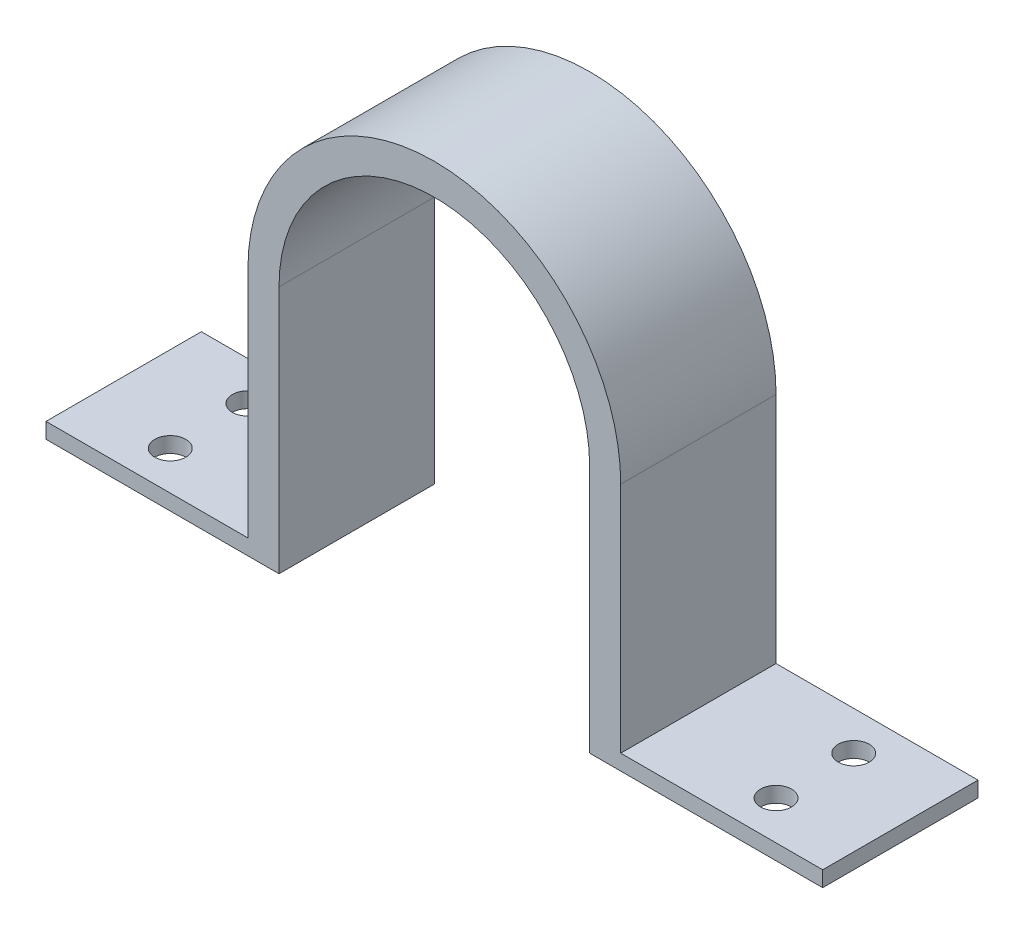
ISO-10303-21;
HEADER;
FILE_DESCRIPTION(('STEP AP214'),'2;1');
FILE_NAME('part.step','',(''),(''),'','','');
FILE_SCHEMA(('AUTOMOTIVE_DESIGN { 1 0 10303 214 1 1 1 1 }'));
ENDSEC;
DATA;
#1=APPLICATION_CONTEXT('core data for automotive mechanical design processes');
#2=APPLICATION_PROTOCOL_DEFINITION('international standard','automotive_design',2000,#1);
#3=PRODUCT_CONTEXT('',#1,'mechanical');
#4=PRODUCT('Part','Part','',(#3));
#5=PRODUCT_RELATED_PRODUCT_CATEGORY('part','',(#4));
#6=PRODUCT_DEFINITION_FORMATION('','',#4);
#7=PRODUCT_DEFINITION_CONTEXT('part definition',#1,'design');
#8=PRODUCT_DEFINITION('design','',#6,#7);
#9=PRODUCT_DEFINITION_SHAPE('','',#8);
#10=(LENGTH_UNIT() NAMED_UNIT(*) SI_UNIT(.MILLI.,.METRE.));
#11=(NAMED_UNIT(*) PLANE_ANGLE_UNIT() SI_UNIT($,.RADIAN.));
#12=(NAMED_UNIT(*) SI_UNIT($,.STERADIAN.) SOLID_ANGLE_UNIT());
#13=UNCERTAINTY_MEASURE_WITH_UNIT(LENGTH_MEASURE(1.E-05),#10,'distance_accuracy_value','');
#14=(GEOMETRIC_REPRESENTATION_CONTEXT(3) GLOBAL_UNCERTAINTY_ASSIGNED_CONTEXT((#13)) GLOBAL_UNIT_ASSIGNED_CONTEXT((#10,
#11,#12)) REPRESENTATION_CONTEXT('',''));
#15=CARTESIAN_POINT('',(0.,0.,0.));
#16=DIRECTION('',(0.,0.,1.));
#17=DIRECTION('',(1.,0.,0.));
#18=AXIS2_PLACEMENT_3D('',#15,#16,#17);
#19=CARTESIAN_POINT('',(56.,0.,20.));
#20=DIRECTION('',(0.,-1.,0.));
#21=DIRECTION('',(1.,0.,0.));
#22=AXIS2_PLACEMENT_3D('',#19,#20,#21);
#23=PLANE('',#22);
#24=CARTESIAN_POINT('',(45.,0.,4.99999999999999));
#25=DIRECTION('',(0.,1.,0.));
#26=DIRECTION('',(-1.,0.,0.));
#27=AXIS2_PLACEMENT_3D('',#24,#25,#26);
#28=CIRCLE('',#27,2.00000000000002);
#29=CARTESIAN_POINT('',(43.,0.,4.99999999999999));
#30=VERTEX_POINT('',#29);
#31=EDGE_CURVE('E318',#30,#30,#28,.F.);
#32=ORIENTED_EDGE('',*,*,#31,.T.);
#33=EDGE_LOOP('',(#32));
#34=FACE_BOUND('',#33,.T.);
#35=CARTESIAN_POINT('',(45.,0.,15.));
#36=DIRECTION('',(0.,-1.,0.));
#37=DIRECTION('',(1.,0.,0.));
#38=AXIS2_PLACEMENT_3D('',#35,#36,#37);
#39=CIRCLE('',#38,2.00000000000002);
#40=CARTESIAN_POINT('',(47.,0.,15.));
#41=VERTEX_POINT('',#40);
#42=EDGE_CURVE('E321',#41,#41,#39,.T.);
#43=ORIENTED_EDGE('',*,*,#42,.T.);
#44=EDGE_LOOP('',(#43));
#45=FACE_BOUND('',#44,.T.);
#46=DIRECTION('',(-1.,0.,0.));
#47=VECTOR('',#46,1.);
#48=CARTESIAN_POINT('',(56.,0.,0.));
#49=LINE('',#48,#47);
#50=CARTESIAN_POINT('',(56.,0.,0.));
#51=VERTEX_POINT('',#50);
#52=CARTESIAN_POINT('',(30.,0.,0.));
#53=VERTEX_POINT('',#52);
#54=EDGE_CURVE('E171',#51,#53,#49,.T.);
#55=ORIENTED_EDGE('',*,*,#54,.T.);
#56=DIRECTION('',(0.,0.,-1.));
#57=VECTOR('',#56,1.);
#58=CARTESIAN_POINT('',(30.,0.,20.));
#59=LINE('',#58,#57);
#60=CARTESIAN_POINT('',(30.,0.,20.));
#61=VERTEX_POINT('',#60);
#62=EDGE_CURVE('E11',#61,#53,#59,.T.);
#63=ORIENTED_EDGE('',*,*,#62,.F.);
#64=DIRECTION('',(-1.,0.,0.));
#65=VECTOR('',#64,1.);
#66=CARTESIAN_POINT('',(56.,0.,20.));
#67=LINE('',#66,#65);
#68=CARTESIAN_POINT('',(56.,0.,20.));
#69=VERTEX_POINT('',#68);
#70=EDGE_CURVE('E208',#69,#61,#67,.T.);
#71=ORIENTED_EDGE('',*,*,#70,.F.);
#72=DIRECTION('',(0.,0.,-1.));
#73=VECTOR('',#72,1.);
#74=CARTESIAN_POINT('',(56.,0.,20.));
#75=LINE('',#74,#73);
#76=EDGE_CURVE('E167',#69,#51,#75,.T.);
#77=ORIENTED_EDGE('',*,*,#76,.T.);
#78=EDGE_LOOP('',(#55,#63,#71,#77));
#79=FACE_BOUND('',#78,.T.);
#80=ADVANCED_FACE('F47',(#34,#45,#79),#23,.F.);
#81=CARTESIAN_POINT('',(30.,0.,20.));
#82=DIRECTION('',(-1.,0.,0.));
#83=DIRECTION('',(0.,0.,1.));
#84=AXIS2_PLACEMENT_3D('',#81,#82,#83);
#85=PLANE('',#84);
#86=DIRECTION('',(0.,1.,0.));
#87=VECTOR('',#86,1.);
#88=CARTESIAN_POINT('',(30.,0.,0.));
#89=LINE('',#88,#87);
#90=CARTESIAN_POINT('',(30.,30.,0.));
#91=VERTEX_POINT('',#90);
#92=EDGE_CURVE('E175',#53,#91,#89,.T.);
#93=ORIENTED_EDGE('',*,*,#92,.T.);
#94=DIRECTION('',(0.,0.,-1.));
#95=VECTOR('',#94,1.);
#96=CARTESIAN_POINT('',(30.,30.,20.));
#97=LINE('',#96,#95);
#98=CARTESIAN_POINT('',(30.,30.,20.));
#99=VERTEX_POINT('',#98);
#100=EDGE_CURVE('E56',#99,#91,#97,.T.);
#101=ORIENTED_EDGE('',*,*,#100,.F.);
#102=DIRECTION('',(0.,1.,0.));
#103=VECTOR('',#102,1.);
#104=CARTESIAN_POINT('',(30.,0.,20.));
#105=LINE('',#104,#103);
#106=EDGE_CURVE('E119',#61,#99,#105,.T.);
#107=ORIENTED_EDGE('',*,*,#106,.F.);
#108=ORIENTED_EDGE('',*,*,#62,.T.);
#109=EDGE_LOOP('',(#93,#101,#107,#108));
#110=FACE_BOUND('',#109,.T.);
#111=ADVANCED_FACE('F308',(#110),#85,.F.);
#112=CARTESIAN_POINT('',(6.,30.,20.));
#113=DIRECTION('',(0.,0.,-1.));
#114=DIRECTION('',(-1.,0.,0.));
#115=AXIS2_PLACEMENT_3D('',#112,#113,#114);
#116=CYLINDRICAL_SURFACE('',#115,24.);
#117=CARTESIAN_POINT('',(6.,30.,0.));
#118=DIRECTION('',(0.,0.,1.));
#119=DIRECTION('',(1.,0.,0.));
#120=AXIS2_PLACEMENT_3D('',#117,#118,#119);
#121=CIRCLE('',#120,24.);
#122=CARTESIAN_POINT('',(-18.,30.,0.));
#123=VERTEX_POINT('',#122);
#124=EDGE_CURVE('E179',#91,#123,#121,.T.);
#125=ORIENTED_EDGE('',*,*,#124,.T.);
#126=DIRECTION('',(0.,0.,-1.));
#127=VECTOR('',#126,1.);
#128=CARTESIAN_POINT('',(-18.,30.,20.));
#129=LINE('',#128,#127);
#130=CARTESIAN_POINT('',(-18.,30.,20.));
#131=VERTEX_POINT('',#130);
#132=EDGE_CURVE('E235',#131,#123,#129,.T.);
#133=ORIENTED_EDGE('',*,*,#132,.F.);
#134=CARTESIAN_POINT('',(6.,30.,20.));
#135=DIRECTION('',(0.,0.,1.));
#136=DIRECTION('',(1.,0.,0.));
#137=AXIS2_PLACEMENT_3D('',#134,#135,#136);
#138=CIRCLE('',#137,24.);
#139=EDGE_CURVE('E249',#99,#131,#138,.T.);
#140=ORIENTED_EDGE('',*,*,#139,.F.);
#141=ORIENTED_EDGE('',*,*,#100,.T.);
#142=EDGE_LOOP('',(#125,#133,#140,#141));
#143=FACE_BOUND('',#142,.T.);
#144=ADVANCED_FACE('F247',(#143),#116,.T.);
#145=CARTESIAN_POINT('',(-18.,0.,20.));
#146=DIRECTION('',(1.,0.,0.));
#147=DIRECTION('',(0.,1.,0.));
#148=AXIS2_PLACEMENT_3D('',#145,#146,#147);
#149=PLANE('',#148);
#150=DIRECTION('',(0.,-1.,0.));
#151=VECTOR('',#150,1.);
#152=CARTESIAN_POINT('',(-18.,0.,0.));
#153=LINE('',#152,#151);
#154=CARTESIAN_POINT('',(-18.,0.,0.));
#155=VERTEX_POINT('',#154);
#156=EDGE_CURVE('E182',#123,#155,#153,.T.);
#157=ORIENTED_EDGE('',*,*,#156,.T.);
#158=DIRECTION('',(0.,0.,-1.));
#159=VECTOR('',#158,1.);
#160=CARTESIAN_POINT('',(-18.,0.,20.));
#161=LINE('',#160,#159);
#162=CARTESIAN_POINT('',(-18.,0.,20.));
#163=VERTEX_POINT('',#162);
#164=EDGE_CURVE('E231',#163,#155,#161,.T.);
#165=ORIENTED_EDGE('',*,*,#164,.F.);
#166=DIRECTION('',(0.,-1.,0.));
#167=VECTOR('',#166,1.);
#168=CARTESIAN_POINT('',(-18.,0.,20.));
#169=LINE('',#168,#167);
#170=EDGE_CURVE('E268',#131,#163,#169,.T.);
#171=ORIENTED_EDGE('',*,*,#170,.F.);
#172=ORIENTED_EDGE('',*,*,#132,.T.);
#173=EDGE_LOOP('',(#157,#165,#171,#172));
#174=FACE_BOUND('',#173,.T.);
#175=ADVANCED_FACE('F258',(#174),#149,.F.);
#176=CARTESIAN_POINT('',(-18.,0.,20.));
#177=DIRECTION('',(0.,-1.,0.));
#178=DIRECTION('',(1.,0.,0.));
#179=AXIS2_PLACEMENT_3D('',#176,#177,#178);
#180=PLANE('',#179);
#181=CARTESIAN_POINT('',(-33.,0.,15.));
#182=DIRECTION('',(0.,1.,0.));
#183=DIRECTION('',(-1.,0.,0.));
#184=AXIS2_PLACEMENT_3D('',#181,#182,#183);
#185=CIRCLE('',#184,2.);
#186=CARTESIAN_POINT('',(-35.,0.,15.));
#187=VERTEX_POINT('',#186);
#188=EDGE_CURVE('E335',#187,#187,#185,.T.);
#189=ORIENTED_EDGE('',*,*,#188,.F.);
#190=EDGE_LOOP('',(#189));
#191=FACE_BOUND('',#190,.T.);
#192=CARTESIAN_POINT('',(-33.,0.,5.));
#193=DIRECTION('',(0.,1.,0.));
#194=DIRECTION('',(-1.,0.,0.));
#195=AXIS2_PLACEMENT_3D('',#192,#193,#194);
#196=CIRCLE('',#195,2.);
#197=CARTESIAN_POINT('',(-35.,0.,5.));
#198=VERTEX_POINT('',#197);
#199=EDGE_CURVE('E339',#198,#198,#196,.T.);
#200=ORIENTED_EDGE('',*,*,#199,.F.);
#201=EDGE_LOOP('',(#200));
#202=FACE_BOUND('',#201,.T.);
#203=DIRECTION('',(-1.,0.,0.));
#204=VECTOR('',#203,1.);
#205=CARTESIAN_POINT('',(-18.,0.,0.));
#206=LINE('',#205,#204);
#207=CARTESIAN_POINT('',(-44.,0.,0.));
#208=VERTEX_POINT('',#207);
#209=EDGE_CURVE('E185',#155,#208,#206,.T.);
#210=ORIENTED_EDGE('',*,*,#209,.T.);
#211=DIRECTION('',(0.,0.,-1.));
#212=VECTOR('',#211,1.);
#213=CARTESIAN_POINT('',(-44.,0.,20.));
#214=LINE('',#213,#212);
#215=CARTESIAN_POINT('',(-44.,0.,20.));
#216=VERTEX_POINT('',#215);
#217=EDGE_CURVE('E227',#216,#208,#214,.T.);
#218=ORIENTED_EDGE('',*,*,#217,.F.);
#219=DIRECTION('',(-1.,0.,0.));
#220=VECTOR('',#219,1.);
#221=CARTESIAN_POINT('',(-18.,0.,20.));
#222=LINE('',#221,#220);
#223=EDGE_CURVE('E264',#163,#216,#222,.T.);
#224=ORIENTED_EDGE('',*,*,#223,.F.);
#225=ORIENTED_EDGE('',*,*,#164,.T.);
#226=EDGE_LOOP('',(#210,#218,#224,#225));
#227=FACE_BOUND('',#226,.T.);
#228=ADVANCED_FACE('F262',(#191,#202,#227),#180,.F.);
#229=CARTESIAN_POINT('',(-44.,0.,20.));
#230=DIRECTION('',(1.,0.,0.));
#231=DIRECTION('',(0.,0.,-1.));
#232=AXIS2_PLACEMENT_3D('',#229,#230,#231);
#233=PLANE('',#232);
#234=DIRECTION('',(0.,-1.,0.));
#235=VECTOR('',#234,1.);
#236=CARTESIAN_POINT('',(-44.,0.,0.));
#237=LINE('',#236,#235);
#238=CARTESIAN_POINT('',(-44.,-2.,0.));
#239=VERTEX_POINT('',#238);
#240=EDGE_CURVE('E188',#208,#239,#237,.T.);
#241=ORIENTED_EDGE('',*,*,#240,.T.);
#242=DIRECTION('',(0.,0.,-1.));
#243=VECTOR('',#242,1.);
#244=CARTESIAN_POINT('',(-44.,-2.,20.));
#245=LINE('',#244,#243);
#246=CARTESIAN_POINT('',(-44.,-2.,20.));
#247=VERTEX_POINT('',#246);
#248=EDGE_CURVE('E223',#247,#239,#245,.T.);
#249=ORIENTED_EDGE('',*,*,#248,.F.);
#250=DIRECTION('',(0.,-1.,0.));
#251=VECTOR('',#250,1.);
#252=CARTESIAN_POINT('',(-44.,0.,20.));
#253=LINE('',#252,#251);
#254=EDGE_CURVE('E267',#216,#247,#253,.T.);
#255=ORIENTED_EDGE('',*,*,#254,.F.);
#256=ORIENTED_EDGE('',*,*,#217,.T.);
#257=EDGE_LOOP('',(#241,#249,#255,#256));
#258=FACE_BOUND('',#257,.T.);
#259=ADVANCED_FACE('F375',(#258),#233,.F.);
#260=CARTESIAN_POINT('',(-44.,-2.,20.));
#261=DIRECTION('',(0.,1.,0.));
#262=DIRECTION('',(-1.,0.,0.));
#263=AXIS2_PLACEMENT_3D('',#260,#261,#262);
#264=PLANE('',#263);
#265=CARTESIAN_POINT('',(-33.,-2.00000000000002,15.));
#266=DIRECTION('',(0.,1.,0.));
#267=DIRECTION('',(-1.,0.,0.));
#268=AXIS2_PLACEMENT_3D('',#265,#266,#267);
#269=CIRCLE('',#268,2.);
#270=CARTESIAN_POINT('',(-35.,-2.00000000000002,15.));
#271=VERTEX_POINT('',#270);
#272=EDGE_CURVE('E340',#271,#271,#269,.T.);
#273=ORIENTED_EDGE('',*,*,#272,.T.);
#274=EDGE_LOOP('',(#273));
#275=FACE_BOUND('',#274,.T.);
#276=CARTESIAN_POINT('',(-33.,-2.00000000000002,5.));
#277=DIRECTION('',(0.,1.,0.));
#278=DIRECTION('',(-1.,0.,0.));
#279=AXIS2_PLACEMENT_3D('',#276,#277,#278);
#280=CIRCLE('',#279,2.);
#281=CARTESIAN_POINT('',(-35.,-2.00000000000002,5.));
#282=VERTEX_POINT('',#281);
#283=EDGE_CURVE('E176',#282,#282,#280,.T.);
#284=ORIENTED_EDGE('',*,*,#283,.T.);
#285=EDGE_LOOP('',(#284));
#286=FACE_BOUND('',#285,.T.);
#287=DIRECTION('',(1.,0.,0.));
#288=VECTOR('',#287,1.);
#289=CARTESIAN_POINT('',(-44.,-2.,0.));
#290=LINE('',#289,#288);
#291=CARTESIAN_POINT('',(-14.,-2.,0.));
#292=VERTEX_POINT('',#291);
#293=EDGE_CURVE('E191',#239,#292,#290,.T.);
#294=ORIENTED_EDGE('',*,*,#293,.T.);
#295=DIRECTION('',(0.,0.,-1.));
#296=VECTOR('',#295,1.);
#297=CARTESIAN_POINT('',(-14.,-2.,20.));
#298=LINE('',#297,#296);
#299=CARTESIAN_POINT('',(-14.,-2.,20.));
#300=VERTEX_POINT('',#299);
#301=EDGE_CURVE('E219',#300,#292,#298,.T.);
#302=ORIENTED_EDGE('',*,*,#301,.F.);
#303=DIRECTION('',(1.,0.,0.));
#304=VECTOR('',#303,1.);
#305=CARTESIAN_POINT('',(-44.,-2.,20.));
#306=LINE('',#305,#304);
#307=EDGE_CURVE('E272',#247,#300,#306,.T.);
#308=ORIENTED_EDGE('',*,*,#307,.F.);
#309=ORIENTED_EDGE('',*,*,#248,.T.);
#310=EDGE_LOOP('',(#294,#302,#308,#309));
#311=FACE_BOUND('',#310,.T.);
#312=ADVANCED_FACE('F372',(#275,#286,#311),#264,.F.);
#313=CARTESIAN_POINT('',(-14.,30.,20.));
#314=DIRECTION('',(-1.,0.,0.));
#315=DIRECTION('',(0.,0.,1.));
#316=AXIS2_PLACEMENT_3D('',#313,#314,#315);
#317=PLANE('',#316);
#318=DIRECTION('',(0.,1.,0.));
#319=VECTOR('',#318,1.);
#320=CARTESIAN_POINT('',(-14.,30.,0.));
#321=LINE('',#320,#319);
#322=CARTESIAN_POINT('',(-14.,30.,0.));
#323=VERTEX_POINT('',#322);
#324=EDGE_CURVE('E195',#292,#323,#321,.T.);
#325=ORIENTED_EDGE('',*,*,#324,.T.);
#326=DIRECTION('',(0.,0.,-1.));
#327=VECTOR('',#326,1.);
#328=CARTESIAN_POINT('',(-14.,30.,20.));
#329=LINE('',#328,#327);
#330=CARTESIAN_POINT('',(-14.,30.,20.));
#331=VERTEX_POINT('',#330);
#332=EDGE_CURVE('E215',#331,#323,#329,.T.);
#333=ORIENTED_EDGE('',*,*,#332,.F.);
#334=DIRECTION('',(0.,1.,0.));
#335=VECTOR('',#334,1.);
#336=CARTESIAN_POINT('',(-14.,-2.,20.));
#337=LINE('',#336,#335);
#338=EDGE_CURVE('E279',#300,#331,#337,.T.);
#339=ORIENTED_EDGE('',*,*,#338,.F.);
#340=ORIENTED_EDGE('',*,*,#301,.T.);
#341=EDGE_LOOP('',(#325,#333,#339,#340));
#342=FACE_BOUND('',#341,.T.);
#343=ADVANCED_FACE('F287',(#342),#317,.F.);
#344=CARTESIAN_POINT('',(6.,30.,20.));
#345=DIRECTION('',(0.,0.,-1.));
#346=DIRECTION('',(-1.,0.,0.));
#347=AXIS2_PLACEMENT_3D('',#344,#345,#346);
#348=CYLINDRICAL_SURFACE('',#347,20.);
#349=CARTESIAN_POINT('',(6.,30.,0.));
#350=DIRECTION('',(0.,0.,-1.));
#351=DIRECTION('',(-1.,0.,0.));
#352=AXIS2_PLACEMENT_3D('',#349,#350,#351);
#353=CIRCLE('',#352,20.);
#354=CARTESIAN_POINT('',(26.,30.,0.));
#355=VERTEX_POINT('',#354);
#356=EDGE_CURVE('E198',#323,#355,#353,.T.);
#357=ORIENTED_EDGE('',*,*,#356,.T.);
#358=DIRECTION('',(0.,0.,-1.));
#359=VECTOR('',#358,1.);
#360=CARTESIAN_POINT('',(26.,30.,20.));
#361=LINE('',#360,#359);
#362=CARTESIAN_POINT('',(26.,30.,20.));
#363=VERTEX_POINT('',#362);
#364=EDGE_CURVE('E160',#363,#355,#361,.T.);
#365=ORIENTED_EDGE('',*,*,#364,.F.);
#366=CARTESIAN_POINT('',(6.,30.,20.));
#367=DIRECTION('',(0.,0.,-1.));
#368=DIRECTION('',(-1.,0.,0.));
#369=AXIS2_PLACEMENT_3D('',#366,#367,#368);
#370=CIRCLE('',#369,20.);
#371=EDGE_CURVE('E150',#331,#363,#370,.T.);
#372=ORIENTED_EDGE('',*,*,#371,.F.);
#373=ORIENTED_EDGE('',*,*,#332,.T.);
#374=EDGE_LOOP('',(#357,#365,#372,#373));
#375=FACE_BOUND('',#374,.T.);
#376=ADVANCED_FACE('F290',(#375),#348,.F.);
#377=CARTESIAN_POINT('',(26.,0.,20.));
#378=DIRECTION('',(1.,0.,0.));
#379=DIRECTION('',(0.,1.,0.));
#380=AXIS2_PLACEMENT_3D('',#377,#378,#379);
#381=PLANE('',#380);
#382=DIRECTION('',(0.,-1.,0.));
#383=VECTOR('',#382,1.);
#384=CARTESIAN_POINT('',(26.,0.,0.));
#385=LINE('',#384,#383);
#386=CARTESIAN_POINT('',(26.,-1.99999999999999,0.));
#387=VERTEX_POINT('',#386);
#388=EDGE_CURVE('E158',#355,#387,#385,.T.);
#389=ORIENTED_EDGE('',*,*,#388,.T.);
#390=DIRECTION('',(0.,0.,-1.));
#391=VECTOR('',#390,1.);
#392=CARTESIAN_POINT('',(26.,-1.99999999999999,20.));
#393=LINE('',#392,#391);
#394=CARTESIAN_POINT('',(26.,-1.99999999999999,20.));
#395=VERTEX_POINT('',#394);
#396=EDGE_CURVE('E156',#395,#387,#393,.T.);
#397=ORIENTED_EDGE('',*,*,#396,.F.);
#398=DIRECTION('',(0.,-1.,0.));
#399=VECTOR('',#398,1.);
#400=CARTESIAN_POINT('',(26.,30.,20.));
#401=LINE('',#400,#399);
#402=EDGE_CURVE('E144',#363,#395,#401,.T.);
#403=ORIENTED_EDGE('',*,*,#402,.F.);
#404=ORIENTED_EDGE('',*,*,#364,.T.);
#405=EDGE_LOOP('',(#389,#397,#403,#404));
#406=FACE_BOUND('',#405,.T.);
#407=ADVANCED_FACE('F157',(#406),#381,.F.);
#408=CARTESIAN_POINT('',(26.,-1.99999999999999,20.));
#409=DIRECTION('',(0.,1.,0.));
#410=DIRECTION('',(-1.,0.,0.));
#411=AXIS2_PLACEMENT_3D('',#408,#409,#410);
#412=PLANE('',#411);
#413=CARTESIAN_POINT('',(45.,-2.00000000000001,4.99999999999999));
#414=DIRECTION('',(0.,1.,0.));
#415=DIRECTION('',(-1.,0.,0.));
#416=AXIS2_PLACEMENT_3D('',#413,#414,#415);
#417=CIRCLE('',#416,2.00000000000002);
#418=CARTESIAN_POINT('',(43.,-2.00000000000001,4.99999999999999));
#419=VERTEX_POINT('',#418);
#420=EDGE_CURVE('E324',#419,#419,#417,.F.);
#421=ORIENTED_EDGE('',*,*,#420,.F.);
#422=EDGE_LOOP('',(#421));
#423=FACE_BOUND('',#422,.T.);
#424=CARTESIAN_POINT('',(45.,-2.00000000000001,15.));
#425=DIRECTION('',(0.,-1.,0.));
#426=DIRECTION('',(1.,0.,0.));
#427=AXIS2_PLACEMENT_3D('',#424,#425,#426);
#428=CIRCLE('',#427,2.00000000000002);
#429=CARTESIAN_POINT('',(47.,-2.,15.));
#430=VERTEX_POINT('',#429);
#431=EDGE_CURVE('E325',#430,#430,#428,.T.);
#432=ORIENTED_EDGE('',*,*,#431,.F.);
#433=EDGE_LOOP('',(#432));
#434=FACE_BOUND('',#433,.T.);
#435=DIRECTION('',(1.,0.,0.));
#436=VECTOR('',#435,1.);
#437=CARTESIAN_POINT('',(26.,-1.99999999999999,0.));
#438=LINE('',#437,#436);
#439=CARTESIAN_POINT('',(56.,-1.99999999999999,0.));
#440=VERTEX_POINT('',#439);
#441=EDGE_CURVE('E105',#387,#440,#438,.T.);
#442=ORIENTED_EDGE('',*,*,#441,.T.);
#443=DIRECTION('',(0.,0.,-1.));
#444=VECTOR('',#443,1.);
#445=CARTESIAN_POINT('',(56.,-1.99999999999999,20.));
#446=LINE('',#445,#444);
#447=CARTESIAN_POINT('',(56.,-1.99999999999999,20.));
#448=VERTEX_POINT('',#447);
#449=EDGE_CURVE('E161',#448,#440,#446,.T.);
#450=ORIENTED_EDGE('',*,*,#449,.F.);
#451=DIRECTION('',(1.,0.,0.));
#452=VECTOR('',#451,1.);
#453=CARTESIAN_POINT('',(26.,-1.99999999999999,20.));
#454=LINE('',#453,#452);
#455=EDGE_CURVE('E148',#395,#448,#454,.T.);
#456=ORIENTED_EDGE('',*,*,#455,.F.);
#457=ORIENTED_EDGE('',*,*,#396,.T.);
#458=EDGE_LOOP('',(#442,#450,#456,#457));
#459=FACE_BOUND('',#458,.T.);
#460=ADVANCED_FACE('F163',(#423,#434,#459),#412,.F.);
#461=CARTESIAN_POINT('',(56.,-1.99999999999999,20.));
#462=DIRECTION('',(-1.,0.,0.));
#463=DIRECTION('',(0.,0.,1.));
#464=AXIS2_PLACEMENT_3D('',#461,#462,#463);
#465=PLANE('',#464);
#466=DIRECTION('',(0.,1.,0.));
#467=VECTOR('',#466,1.);
#468=CARTESIAN_POINT('',(56.,-1.99999999999999,0.));
#469=LINE('',#468,#467);
#470=EDGE_CURVE('E111',#440,#51,#469,.T.);
#471=ORIENTED_EDGE('',*,*,#470,.T.);
#472=ORIENTED_EDGE('',*,*,#76,.F.);
#473=DIRECTION('',(0.,1.,0.));
#474=VECTOR('',#473,1.);
#475=CARTESIAN_POINT('',(56.,-1.99999999999999,20.));
#476=LINE('',#475,#474);
#477=EDGE_CURVE('E64',#448,#69,#476,.T.);
#478=ORIENTED_EDGE('',*,*,#477,.F.);
#479=ORIENTED_EDGE('',*,*,#449,.T.);
#480=EDGE_LOOP('',(#471,#472,#478,#479));
#481=FACE_BOUND('',#480,.T.);
#482=ADVANCED_FACE('F295',(#481),#465,.F.);
#483=CARTESIAN_POINT('',(6.,30.,20.));
#484=DIRECTION('',(0.,0.,1.));
#485=DIRECTION('',(1.,0.,0.));
#486=AXIS2_PLACEMENT_3D('',#483,#484,#485);
#487=PLANE('',#486);
#488=ORIENTED_EDGE('',*,*,#70,.T.);
#489=ORIENTED_EDGE('',*,*,#106,.T.);
#490=ORIENTED_EDGE('',*,*,#139,.T.);
#491=ORIENTED_EDGE('',*,*,#170,.T.);
#492=ORIENTED_EDGE('',*,*,#223,.T.);
#493=ORIENTED_EDGE('',*,*,#254,.T.);
#494=ORIENTED_EDGE('',*,*,#307,.T.);
#495=ORIENTED_EDGE('',*,*,#338,.T.);
#496=ORIENTED_EDGE('',*,*,#371,.T.);
#497=ORIENTED_EDGE('',*,*,#402,.T.);
#498=ORIENTED_EDGE('',*,*,#455,.T.);
#499=ORIENTED_EDGE('',*,*,#477,.T.);
#500=EDGE_LOOP('',(#488,#489,#490,#491,#492,#493,#494,#495,#496,#497,#498,#499));
#501=FACE_BOUND('',#500,.T.);
#502=ADVANCED_FACE('F146',(#501),#487,.T.);
#503=CARTESIAN_POINT('',(6.,30.,0.));
#504=DIRECTION('',(0.,0.,1.));
#505=DIRECTION('',(1.,0.,0.));
#506=AXIS2_PLACEMENT_3D('',#503,#504,#505);
#507=PLANE('',#506);
#508=ORIENTED_EDGE('',*,*,#54,.F.);
#509=ORIENTED_EDGE('',*,*,#470,.F.);
#510=ORIENTED_EDGE('',*,*,#441,.F.);
#511=ORIENTED_EDGE('',*,*,#388,.F.);
#512=ORIENTED_EDGE('',*,*,#356,.F.);
#513=ORIENTED_EDGE('',*,*,#324,.F.);
#514=ORIENTED_EDGE('',*,*,#293,.F.);
#515=ORIENTED_EDGE('',*,*,#240,.F.);
#516=ORIENTED_EDGE('',*,*,#209,.F.);
#517=ORIENTED_EDGE('',*,*,#156,.F.);
#518=ORIENTED_EDGE('',*,*,#124,.F.);
#519=ORIENTED_EDGE('',*,*,#92,.F.);
#520=EDGE_LOOP('',(#508,#509,#510,#511,#512,#513,#514,#515,#516,#517,#518,#519));
#521=FACE_BOUND('',#520,.T.);
#522=ADVANCED_FACE('F253',(#521),#507,.F.);
#523=CARTESIAN_POINT('',(45.,-2.00000000000001,15.));
#524=DIRECTION('',(0.,1.,0.));
#525=DIRECTION('',(-1.,0.,0.));
#526=AXIS2_PLACEMENT_3D('',#523,#524,#525);
#527=CYLINDRICAL_SURFACE('',#526,2.00000000000002);
#528=ORIENTED_EDGE('',*,*,#431,.T.);
#529=EDGE_LOOP('',(#528));
#530=FACE_BOUND('',#529,.T.);
#531=ORIENTED_EDGE('',*,*,#42,.F.);
#532=EDGE_LOOP('',(#531));
#533=FACE_BOUND('',#532,.T.);
#534=ADVANCED_FACE('F394',(#530,#533),#527,.F.);
#535=CARTESIAN_POINT('',(45.,-2.00000000000001,4.99999999999999));
#536=DIRECTION('',(0.,1.,0.));
#537=DIRECTION('',(-1.,0.,0.));
#538=AXIS2_PLACEMENT_3D('',#535,#536,#537);
#539=CYLINDRICAL_SURFACE('',#538,2.00000000000002);
#540=ORIENTED_EDGE('',*,*,#420,.T.);
#541=EDGE_LOOP('',(#540));
#542=FACE_BOUND('',#541,.T.);
#543=ORIENTED_EDGE('',*,*,#31,.F.);
#544=EDGE_LOOP('',(#543));
#545=FACE_BOUND('',#544,.T.);
#546=ADVANCED_FACE('F398',(#542,#545),#539,.F.);
#547=CARTESIAN_POINT('',(-33.,-2.00000000000002,5.));
#548=DIRECTION('',(0.,1.,0.));
#549=DIRECTION('',(-1.,0.,0.));
#550=AXIS2_PLACEMENT_3D('',#547,#548,#549);
#551=CYLINDRICAL_SURFACE('',#550,2.);
#552=ORIENTED_EDGE('',*,*,#283,.F.);
#553=EDGE_LOOP('',(#552));
#554=FACE_BOUND('',#553,.T.);
#555=ORIENTED_EDGE('',*,*,#199,.T.);
#556=EDGE_LOOP('',(#555));
#557=FACE_BOUND('',#556,.T.);
#558=ADVANCED_FACE('F408',(#554,#557),#551,.F.);
#559=CARTESIAN_POINT('',(-33.,-2.00000000000002,15.));
#560=DIRECTION('',(0.,1.,0.));
#561=DIRECTION('',(-1.,0.,0.));
#562=AXIS2_PLACEMENT_3D('',#559,#560,#561);
#563=CYLINDRICAL_SURFACE('',#562,2.);
#564=ORIENTED_EDGE('',*,*,#272,.F.);
#565=EDGE_LOOP('',(#564));
#566=FACE_BOUND('',#565,.T.);
#567=ORIENTED_EDGE('',*,*,#188,.T.);
#568=EDGE_LOOP('',(#567));
#569=FACE_BOUND('',#568,.T.);
#570=ADVANCED_FACE('F417',(#566,#569),#563,.F.);
#571=CLOSED_SHELL('',(#80,#111,#144,#175,#228,#259,#312,#343,#376,#407,#460,#482,#502,#522,#534,
#546,#558,#570));
#572=MANIFOLD_SOLID_BREP('B2',#571);
#573=ADVANCED_BREP_SHAPE_REPRESENTATION('',(#18,#572),#14);
#574=SHAPE_DEFINITION_REPRESENTATION(#9,#573);
ENDSEC;
END-ISO-10303-21;
